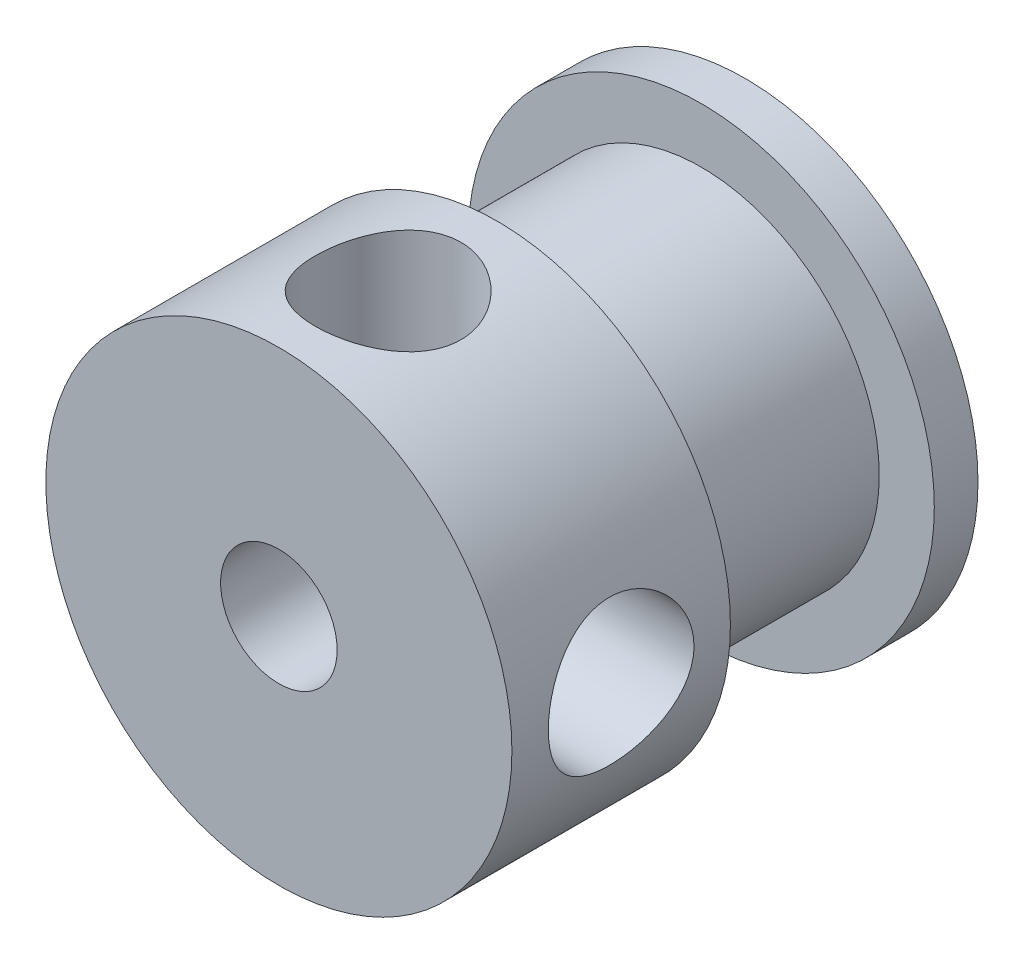
ISO-10303-21;
HEADER;
FILE_DESCRIPTION(('STEP AP214'),'2;1');
FILE_NAME('part.step','',(''),(''),'','','');
FILE_SCHEMA(('AUTOMOTIVE_DESIGN { 1 0 10303 214 1 1 1 1 }'));
ENDSEC;
DATA;
#1=APPLICATION_CONTEXT('core data for automotive mechanical design processes');
#2=APPLICATION_PROTOCOL_DEFINITION('international standard','automotive_design',2000,#1);
#3=PRODUCT_CONTEXT('',#1,'mechanical');
#4=PRODUCT('Part','Part','',(#3));
#5=PRODUCT_RELATED_PRODUCT_CATEGORY('part','',(#4));
#6=PRODUCT_DEFINITION_FORMATION('','',#4);
#7=PRODUCT_DEFINITION_CONTEXT('part definition',#1,'design');
#8=PRODUCT_DEFINITION('design','',#6,#7);
#9=PRODUCT_DEFINITION_SHAPE('','',#8);
#10=(LENGTH_UNIT() NAMED_UNIT(*) SI_UNIT(.MILLI.,.METRE.));
#11=(NAMED_UNIT(*) PLANE_ANGLE_UNIT() SI_UNIT($,.RADIAN.));
#12=(NAMED_UNIT(*) SI_UNIT($,.STERADIAN.) SOLID_ANGLE_UNIT());
#13=UNCERTAINTY_MEASURE_WITH_UNIT(LENGTH_MEASURE(1.E-05),#10,'distance_accuracy_value','');
#14=(GEOMETRIC_REPRESENTATION_CONTEXT(3) GLOBAL_UNCERTAINTY_ASSIGNED_CONTEXT((#13)) GLOBAL_UNIT_ASSIGNED_CONTEXT((#10,
#11,#12)) REPRESENTATION_CONTEXT('',''));
#15=CARTESIAN_POINT('',(0.,0.,0.));
#16=DIRECTION('',(0.,0.,1.));
#17=DIRECTION('',(1.,0.,0.));
#18=AXIS2_PLACEMENT_3D('',#15,#16,#17);
#19=CARTESIAN_POINT('',(0.,0.,1.5));
#20=DIRECTION('',(0.,0.,-1.));
#21=DIRECTION('',(-1.,0.,0.));
#22=AXIS2_PLACEMENT_3D('',#19,#20,#21);
#23=CYLINDRICAL_SURFACE('',#22,8.);
#24=CARTESIAN_POINT('',(0.,0.,1.5));
#25=DIRECTION('',(0.,0.,1.));
#26=DIRECTION('',(1.,0.,0.));
#27=AXIS2_PLACEMENT_3D('',#24,#25,#26);
#28=CIRCLE('',#27,8.);
#29=CARTESIAN_POINT('',(8.,0.,1.5));
#30=VERTEX_POINT('',#29);
#31=EDGE_CURVE('E147',#30,#30,#28,.T.);
#32=ORIENTED_EDGE('',*,*,#31,.F.);
#33=EDGE_LOOP('',(#32));
#34=FACE_BOUND('',#33,.T.);
#35=CARTESIAN_POINT('',(0.,0.,0.));
#36=DIRECTION('',(0.,0.,1.));
#37=DIRECTION('',(1.,0.,0.));
#38=AXIS2_PLACEMENT_3D('',#35,#36,#37);
#39=CIRCLE('',#38,8.);
#40=CARTESIAN_POINT('',(8.,0.,0.));
#41=VERTEX_POINT('',#40);
#42=EDGE_CURVE('E143',#41,#41,#39,.T.);
#43=ORIENTED_EDGE('',*,*,#42,.T.);
#44=EDGE_LOOP('',(#43));
#45=FACE_BOUND('',#44,.T.);
#46=ADVANCED_FACE('F34',(#34,#45),#23,.T.);
#47=CARTESIAN_POINT('',(0.,0.,1.5));
#48=DIRECTION('',(0.,0.,1.));
#49=DIRECTION('',(1.,0.,0.));
#50=AXIS2_PLACEMENT_3D('',#47,#48,#49);
#51=PLANE('',#50);
#52=CARTESIAN_POINT('',(0.,0.,1.5));
#53=DIRECTION('',(0.,0.,1.));
#54=DIRECTION('',(1.,0.,0.));
#55=AXIS2_PLACEMENT_3D('',#52,#53,#54);
#56=CIRCLE('',#55,6.11);
#57=CARTESIAN_POINT('',(6.11,0.,1.5));
#58=VERTEX_POINT('',#57);
#59=EDGE_CURVE('E144',#58,#58,#56,.T.);
#60=ORIENTED_EDGE('',*,*,#59,.F.);
#61=EDGE_LOOP('',(#60));
#62=FACE_BOUND('',#61,.T.);
#63=ORIENTED_EDGE('',*,*,#31,.T.);
#64=EDGE_LOOP('',(#63));
#65=FACE_BOUND('',#64,.T.);
#66=ADVANCED_FACE('F188',(#62,#65),#51,.T.);
#67=CARTESIAN_POINT('',(0.,0.,0.));
#68=DIRECTION('',(0.,0.,1.));
#69=DIRECTION('',(1.,0.,0.));
#70=AXIS2_PLACEMENT_3D('',#67,#68,#69);
#71=PLANE('',#70);
#72=CARTESIAN_POINT('',(0.,0.,0.));
#73=DIRECTION('',(0.,0.,1.));
#74=DIRECTION('',(1.,0.,0.));
#75=AXIS2_PLACEMENT_3D('',#72,#73,#74);
#76=CIRCLE('',#75,2.);
#77=CARTESIAN_POINT('',(2.,0.,0.));
#78=VERTEX_POINT('',#77);
#79=EDGE_CURVE('E133',#78,#78,#76,.F.);
#80=ORIENTED_EDGE('',*,*,#79,.F.);
#81=EDGE_LOOP('',(#80));
#82=FACE_BOUND('',#81,.T.);
#83=ORIENTED_EDGE('',*,*,#42,.F.);
#84=EDGE_LOOP('',(#83));
#85=FACE_BOUND('',#84,.T.);
#86=ADVANCED_FACE('F193',(#82,#85),#71,.F.);
#87=CARTESIAN_POINT('',(0.,0.,8.5));
#88=DIRECTION('',(0.,0.,-1.));
#89=DIRECTION('',(-1.,0.,0.));
#90=AXIS2_PLACEMENT_3D('',#87,#88,#89);
#91=CYLINDRICAL_SURFACE('',#90,6.11);
#92=CARTESIAN_POINT('',(0.,0.,8.5));
#93=DIRECTION('',(0.,0.,1.));
#94=DIRECTION('',(1.,0.,0.));
#95=AXIS2_PLACEMENT_3D('',#92,#93,#94);
#96=CIRCLE('',#95,6.11);
#97=CARTESIAN_POINT('',(6.11,0.,8.5));
#98=VERTEX_POINT('',#97);
#99=EDGE_CURVE('E135',#98,#98,#96,.T.);
#100=ORIENTED_EDGE('',*,*,#99,.F.);
#101=EDGE_LOOP('',(#100));
#102=FACE_BOUND('',#101,.T.);
#103=ORIENTED_EDGE('',*,*,#59,.T.);
#104=EDGE_LOOP('',(#103));
#105=FACE_BOUND('',#104,.T.);
#106=ADVANCED_FACE('F120',(#102,#105),#91,.T.);
#107=CARTESIAN_POINT('',(0.,0.,16.));
#108=DIRECTION('',(0.,0.,-1.));
#109=DIRECTION('',(-1.,0.,0.));
#110=AXIS2_PLACEMENT_3D('',#107,#108,#109);
#111=CYLINDRICAL_SURFACE('',#110,8.);
#112=CARTESIAN_POINT('',(0.,8.,9.75));
#113=CARTESIAN_POINT('',(-0.136878370349093,7.9999993175598,9.75000089317516));
#114=CARTESIAN_POINT('',(-0.273766105005718,7.99645389969682,9.76127845388891));
#115=CARTESIAN_POINT('',(-0.543538419176896,7.98265788177613,9.80597248307847));
#116=CARTESIAN_POINT('',(-0.676422085451814,7.97240576399719,9.83939396272872));
#117=CARTESIAN_POINT('',(-0.934257087301612,7.94631631395819,9.92713874239148));
#118=CARTESIAN_POINT('',(-1.05922035397161,7.9304876299805,9.98142968930593));
#119=CARTESIAN_POINT('',(-1.29826960469292,7.89487938322185,10.1092346353567));
#120=CARTESIAN_POINT('',(-1.41235387088977,7.8750991979981,10.1827516635612));
#121=CARTESIAN_POINT('',(-1.62993066990456,7.83300427480565,10.3493119840347));
#122=CARTESIAN_POINT('',(-1.73304005631332,7.81063431853978,10.4428417701221));
#123=CARTESIAN_POINT('',(-1.92239476407399,7.76620092748417,10.6457367848271));
#124=CARTESIAN_POINT('',(-2.00863694579739,7.74413755046914,10.7551049549891));
#125=CARTESIAN_POINT('',(-2.16388672966227,7.70222289396344,10.9898891276162));
#126=CARTESIAN_POINT('',(-2.23241568300257,7.68243976603591,11.1156349550544));
#127=CARTESIAN_POINT('',(-2.34719482153343,7.64815603598469,11.3775846299637));
#128=CARTESIAN_POINT('',(-2.39345087543889,7.63365404257377,11.5137857115879));
#129=CARTESIAN_POINT('',(-2.46096919860067,7.61215213969002,11.7884561549041));
#130=CARTESIAN_POINT('',(-2.48294220015729,7.60493945859017,11.9267336872777));
#131=CARTESIAN_POINT('',(-2.50349110073976,7.59820110281901,12.2051862378238));
#132=CARTESIAN_POINT('',(-2.50207321991544,7.59867338454669,12.3453607416433));
#133=CARTESIAN_POINT('',(-2.47643649465478,7.60706378150876,12.617748920538));
#134=CARTESIAN_POINT('',(-2.45312115738766,7.61468683491897,12.7500582517231));
#135=CARTESIAN_POINT('',(-2.38581626711252,7.63604051304978,13.0087843130747));
#136=CARTESIAN_POINT('',(-2.34182451689101,7.6497717868623,13.1352004154176));
#137=CARTESIAN_POINT('',(-2.23377749362554,7.68202088028593,13.3807038888653));
#138=CARTESIAN_POINT('',(-2.16943851324163,7.70060569321649,13.499657221384));
#139=CARTESIAN_POINT('',(-2.02272041475696,7.7404371316014,13.7253755357582));
#140=CARTESIAN_POINT('',(-1.94033661043154,7.76168444789102,13.8321373405074));
#141=CARTESIAN_POINT('',(-1.75543390836425,7.80563055600986,14.035549886834));
#142=CARTESIAN_POINT('',(-1.65216914118563,7.82835139211391,14.1315191155594));
#143=CARTESIAN_POINT('',(-1.43072881619106,7.8718314151916,14.3049437871594));
#144=CARTESIAN_POINT('',(-1.31255215469804,7.89259045676745,14.3823978584384));
#145=CARTESIAN_POINT('',(-1.06332922093091,7.93002589780382,14.5170553772025));
#146=CARTESIAN_POINT('',(-0.932189813838559,7.94666921296415,14.5740962709279));
#147=CARTESIAN_POINT('',(-0.661535955565289,7.97375911657108,14.6651060017031));
#148=CARTESIAN_POINT('',(-0.522024061449216,7.98420758650304,14.6990818444768));
#149=CARTESIAN_POINT('',(-0.244370314580689,7.99742778790027,14.741836085158));
#150=CARTESIAN_POINT('',(-0.106383697577686,8.00048045790873,14.751537087187));
#151=CARTESIAN_POINT('',(0.169260611465172,7.99939599461967,14.7480675467253));
#152=CARTESIAN_POINT('',(0.306918348613018,7.9952599116227,14.7349003453548));
#153=CARTESIAN_POINT('',(0.574438665951697,7.98044727539523,14.6868088147872));
#154=CARTESIAN_POINT('',(0.704409956841872,7.96993586221374,14.652433464775));
#155=CARTESIAN_POINT('',(0.956703857722752,7.94360242758579,14.5635712952666));
#156=CARTESIAN_POINT('',(1.07902552089812,7.92777975028687,14.50908199195));
#157=CARTESIAN_POINT('',(1.31586481334437,7.89197085518848,14.3800535669026));
#158=CARTESIAN_POINT('',(1.43011947957558,7.87189253635335,14.3050580250064));
#159=CARTESIAN_POINT('',(1.64473170192052,7.82986820006859,14.1376935797652));
#160=CARTESIAN_POINT('',(1.7450854760879,7.80792167695774,14.0453199645107));
#161=CARTESIAN_POINT('',(1.93317492583804,7.76353989766283,13.8414822198958));
#162=CARTESIAN_POINT('',(2.02025304679062,7.74111973412883,13.7294066725216));
#163=CARTESIAN_POINT('',(2.17442500490303,7.69923894191212,13.4917467672465));
#164=CARTESIAN_POINT('',(2.24151915946859,7.67977826622621,13.366162623946));
#165=CARTESIAN_POINT('',(2.35340166961084,7.64623564661738,13.105309654259));
#166=CARTESIAN_POINT('',(2.39827639112025,7.63213292713749,12.9700807011286));
#167=CARTESIAN_POINT('',(2.4644578863618,7.6110234168862,12.6934550135028));
#168=CARTESIAN_POINT('',(2.48577362827989,7.60401392602456,12.5520606473129));
#169=CARTESIAN_POINT('',(2.50358812316251,7.59816585427753,12.2739918248391));
#170=CARTESIAN_POINT('',(2.50116559243271,7.59897209200283,12.1373930923052));
#171=CARTESIAN_POINT('',(2.47417636257668,7.60780180751807,11.8666508301161));
#172=CARTESIAN_POINT('',(2.44961069645024,7.61582494863208,11.7325071862265));
#173=CARTESIAN_POINT('',(2.37975459827235,7.6379362836678,11.4724119208162));
#174=CARTESIAN_POINT('',(2.33477284812016,7.65193396380514,11.3463691178133));
#175=CARTESIAN_POINT('',(2.22560454669999,7.68439408509128,11.103519172932));
#176=CARTESIAN_POINT('',(2.16141408888473,7.70285743429343,10.9867139158432));
#177=CARTESIAN_POINT('',(2.01271350026986,7.74306974067005,10.7607080591204));
#178=CARTESIAN_POINT('',(1.92750667048264,7.76491897845914,10.6519837409995));
#179=CARTESIAN_POINT('',(1.7404179928096,7.8089799764242,10.450027343776));
#180=CARTESIAN_POINT('',(1.63853168468878,7.83119183213309,10.3567994220179));
#181=CARTESIAN_POINT('',(1.41697332564669,7.87434543904947,10.1854349232741));
#182=CARTESIAN_POINT('',(1.29682914897477,7.89522203461345,10.1078905271001));
#183=CARTESIAN_POINT('',(1.0445582760273,7.93253538593756,9.97420216972109));
#184=CARTESIAN_POINT('',(0.912436315590897,7.94897388631644,9.91804979571633));
#185=CARTESIAN_POINT('',(0.651495270747957,7.97441301466941,9.83281726478307));
#186=CARTESIAN_POINT('',(0.523340674225093,7.98392481612283,9.80185026538933));
#187=CARTESIAN_POINT('',(0.263459790880496,7.99671800680967,9.76044328006457));
#188=CARTESIAN_POINT('',(0.13173423227935,8.00000065679286,9.749999140392));
#189=CARTESIAN_POINT('',(0.,8.,9.75));
#190=B_SPLINE_CURVE_WITH_KNOTS('',3,(#112,#113,#114,#115,#116,#117,#118,#119,#120,#121,#122,
#123,#124,#125,#126,#127,#128,#129,#130,#131,#132,#133,#134,#135,#136,#137,#138,#139,#140,#141,
#142,#143,#144,#145,#146,#147,#148,#149,#150,#151,#152,#153,#154,#155,#156,#157,#158,#159,#160,
#161,#162,#163,#164,#165,#166,#167,#168,#169,#170,#171,#172,#173,#174,#175,#176,#177,#178,#179,
#180,#181,#182,#183,#184,#185,#186,#187,#188,#189),.UNSPECIFIED.,.T.,.F.,(4,2,2,2,2,2,2,2,2,2,2,
2,2,2,2,2,2,2,2,2,2,2,2,2,2,2,2,2,2,2,2,2,2,2,2,2,2,2,4),(0.,0.410150898865019,
0.820394646698132,1.23000495840487,1.63967984311678,2.06075644390316,2.48191134862552,
2.91347542494988,3.34492572559054,3.7633830033442,4.18172900590276,4.58353834844338,
4.98539039958125,5.3931128544109,5.80094132020717,6.227334945592,6.65376014826606,
7.0835092137954,7.51312768989108,7.92615137096475,8.33911471298725,8.74181253445744,
9.14456010068999,9.55712649476686,9.96980491418518,10.3988355742628,10.8278594196742,
11.2552023150671,11.6823824779468,12.0902440696666,12.4980866352126,12.8999582681244,
13.3019116867944,13.7195902803182,14.1373807476578,14.5688133627192,15.0000761335177,
15.3948927332218,15.7896294154519),.UNSPECIFIED.);
#191=CARTESIAN_POINT('',(0.,8.,9.75));
#192=VERTEX_POINT('',#191);
#193=EDGE_CURVE('E72',#192,#192,#190,.T.);
#194=ORIENTED_EDGE('',*,*,#193,.F.);
#195=EDGE_LOOP('',(#194));
#196=FACE_BOUND('',#195,.T.);
#197=CARTESIAN_POINT('',(8.,0.,14.75));
#198=CARTESIAN_POINT('',(7.9999993175598,-0.136878370349093,14.7499991068248));
#199=CARTESIAN_POINT('',(7.99645389969682,-0.273766105005718,14.7387215461111));
#200=CARTESIAN_POINT('',(7.98265788177613,-0.543538419176896,14.6940275169215));
#201=CARTESIAN_POINT('',(7.97240576399719,-0.676422085451814,14.6606060372713));
#202=CARTESIAN_POINT('',(7.94631631395819,-0.934257087301612,14.5728612576085));
#203=CARTESIAN_POINT('',(7.9304876299805,-1.05922035397161,14.5185703106941));
#204=CARTESIAN_POINT('',(7.89487938322185,-1.29826960469292,14.3907653646433));
#205=CARTESIAN_POINT('',(7.8750991979981,-1.41235387088977,14.3172483364388));
#206=CARTESIAN_POINT('',(7.83300427480565,-1.62993066990456,14.1506880159653));
#207=CARTESIAN_POINT('',(7.81063431853978,-1.73304005631332,14.0571582298779));
#208=CARTESIAN_POINT('',(7.76620092748417,-1.92239476407399,13.8542632151729));
#209=CARTESIAN_POINT('',(7.74413755046914,-2.00863694579739,13.7448950450109));
#210=CARTESIAN_POINT('',(7.70222289396344,-2.16388672966227,13.5101108723838));
#211=CARTESIAN_POINT('',(7.68243976603591,-2.23241568300257,13.3843650449456));
#212=CARTESIAN_POINT('',(7.64815603598469,-2.34719482153343,13.1224153700363));
#213=CARTESIAN_POINT('',(7.63365404257377,-2.39345087543889,12.9862142884121));
#214=CARTESIAN_POINT('',(7.61215213969002,-2.46096919860067,12.7115438450959));
#215=CARTESIAN_POINT('',(7.60493945859017,-2.48294220015729,12.5732663127223));
#216=CARTESIAN_POINT('',(7.59820110281901,-2.50349110073976,12.2948137621762));
#217=CARTESIAN_POINT('',(7.59867338454669,-2.50207321991544,12.1546392583567));
#218=CARTESIAN_POINT('',(7.60706378150876,-2.47643649465478,11.882251079462));
#219=CARTESIAN_POINT('',(7.61468683491897,-2.45312115738766,11.7499417482769));
#220=CARTESIAN_POINT('',(7.63604051304978,-2.38581626711252,11.4912156869253));
#221=CARTESIAN_POINT('',(7.6497717868623,-2.34182451689101,11.3647995845824));
#222=CARTESIAN_POINT('',(7.68202088028593,-2.23377749362554,11.1192961111347));
#223=CARTESIAN_POINT('',(7.70060569321649,-2.16943851324163,11.000342778616));
#224=CARTESIAN_POINT('',(7.7404371316014,-2.02272041475696,10.7746244642418));
#225=CARTESIAN_POINT('',(7.76168444789102,-1.94033661043154,10.6678626594926));
#226=CARTESIAN_POINT('',(7.80563055600986,-1.75543390836425,10.464450113166));
#227=CARTESIAN_POINT('',(7.82835139211391,-1.65216914118563,10.3684808844406));
#228=CARTESIAN_POINT('',(7.8718314151916,-1.43072881619106,10.1950562128406));
#229=CARTESIAN_POINT('',(7.89259045676745,-1.31255215469804,10.1176021415616));
#230=CARTESIAN_POINT('',(7.93002589780382,-1.06332922093091,9.98294462279745));
#231=CARTESIAN_POINT('',(7.94666921296415,-0.932189813838559,9.92590372907206));
#232=CARTESIAN_POINT('',(7.97375911657108,-0.661535955565288,9.83489399829687));
#233=CARTESIAN_POINT('',(7.98420758650304,-0.522024061449216,9.80091815552321));
#234=CARTESIAN_POINT('',(7.99742778790027,-0.244370314580689,9.75816391484204));
#235=CARTESIAN_POINT('',(8.00048045790873,-0.106383697577686,9.74846291281295));
#236=CARTESIAN_POINT('',(7.99939599461967,0.169260611465172,9.75193245327466));
#237=CARTESIAN_POINT('',(7.9952599116227,0.306918348613018,9.76509965464522));
#238=CARTESIAN_POINT('',(7.98044727539523,0.574438665951697,9.81319118521277));
#239=CARTESIAN_POINT('',(7.96993586221374,0.704409956841873,9.84756653522498));
#240=CARTESIAN_POINT('',(7.94360242758579,0.956703857722753,9.93642870473343));
#241=CARTESIAN_POINT('',(7.92777975028687,1.07902552089812,9.99091800805003));
#242=CARTESIAN_POINT('',(7.89197085518848,1.31586481334438,10.1199464330974));
#243=CARTESIAN_POINT('',(7.87189253635335,1.43011947957558,10.1949419749936));
#244=CARTESIAN_POINT('',(7.82986820006859,1.64473170192052,10.3623064202348));
#245=CARTESIAN_POINT('',(7.80792167695774,1.7450854760879,10.4546800354893));
#246=CARTESIAN_POINT('',(7.76353989766283,1.93317492583804,10.6585177801042));
#247=CARTESIAN_POINT('',(7.74111973412883,2.02025304679062,10.7705933274784));
#248=CARTESIAN_POINT('',(7.69923894191212,2.17442500490303,11.0082532327535));
#249=CARTESIAN_POINT('',(7.67977826622621,2.24151915946859,11.133837376054));
#250=CARTESIAN_POINT('',(7.64623564661738,2.35340166961084,11.394690345741));
#251=CARTESIAN_POINT('',(7.63213292713749,2.39827639112025,11.5299192988714));
#252=CARTESIAN_POINT('',(7.6110234168862,2.4644578863618,11.8065449864972));
#253=CARTESIAN_POINT('',(7.60401392602456,2.48577362827989,11.9479393526871));
#254=CARTESIAN_POINT('',(7.59816585427753,2.50358812316251,12.2260081751609));
#255=CARTESIAN_POINT('',(7.59897209200284,2.50116559243271,12.3626069076948));
#256=CARTESIAN_POINT('',(7.60780180751807,2.47417636257667,12.6333491698839));
#257=CARTESIAN_POINT('',(7.61582494863208,2.44961069645024,12.7674928137735));
#258=CARTESIAN_POINT('',(7.6379362836678,2.37975459827235,13.0275880791838));
#259=CARTESIAN_POINT('',(7.65193396380513,2.33477284812016,13.1536308821867));
#260=CARTESIAN_POINT('',(7.68439408509128,2.22560454669999,13.396480827068));
#261=CARTESIAN_POINT('',(7.70285743429343,2.16141408888473,13.5132860841568));
#262=CARTESIAN_POINT('',(7.74306974067005,2.01271350026986,13.7392919408796));
#263=CARTESIAN_POINT('',(7.76491897845914,1.92750667048264,13.8480162590005));
#264=CARTESIAN_POINT('',(7.8089799764242,1.7404179928096,14.049972656224));
#265=CARTESIAN_POINT('',(7.83119183213309,1.63853168468878,14.1432005779821));
#266=CARTESIAN_POINT('',(7.87434543904947,1.41697332564669,14.3145650767259));
#267=CARTESIAN_POINT('',(7.89522203461345,1.29682914897477,14.3921094728999));
#268=CARTESIAN_POINT('',(7.93253538593756,1.0445582760273,14.5257978302789));
#269=CARTESIAN_POINT('',(7.94897388631644,0.912436315590897,14.5819502042837));
#270=CARTESIAN_POINT('',(7.97441301466941,0.651495270747957,14.6671827352169));
#271=CARTESIAN_POINT('',(7.98392481612283,0.523340674225092,14.6981497346107));
#272=CARTESIAN_POINT('',(7.99671800680967,0.263459790880495,14.7395567199354));
#273=CARTESIAN_POINT('',(8.00000065679286,0.13173423227935,14.750000859608));
#274=CARTESIAN_POINT('',(8.,0.,14.75));
#275=B_SPLINE_CURVE_WITH_KNOTS('',3,(#197,#198,#199,#200,#201,#202,#203,#204,#205,#206,#207,
#208,#209,#210,#211,#212,#213,#214,#215,#216,#217,#218,#219,#220,#221,#222,#223,#224,#225,#226,
#227,#228,#229,#230,#231,#232,#233,#234,#235,#236,#237,#238,#239,#240,#241,#242,#243,#244,#245,
#246,#247,#248,#249,#250,#251,#252,#253,#254,#255,#256,#257,#258,#259,#260,#261,#262,#263,#264,
#265,#266,#267,#268,#269,#270,#271,#272,#273,#274),.UNSPECIFIED.,.T.,.F.,(4,2,2,2,2,2,2,2,2,2,2,
2,2,2,2,2,2,2,2,2,2,2,2,2,2,2,2,2,2,2,2,2,2,2,2,2,2,2,4),(0.,0.410150898865019,
0.820394646698132,1.23000495840487,1.63967984311678,2.06075644390316,2.48191134862552,
2.91347542494988,3.34492572559054,3.7633830033442,4.18172900590276,4.58353834844338,
4.98539039958125,5.3931128544109,5.80094132020717,6.227334945592,6.65376014826606,
7.0835092137954,7.51312768989108,7.92615137096475,8.33911471298725,8.74181253445744,
9.14456010068999,9.55712649476686,9.96980491418518,10.3988355742628,10.8278594196742,
11.2552023150671,11.6823824779468,12.0902440696666,12.4980866352126,12.8999582681244,
13.3019116867944,13.7195902803182,14.1373807476578,14.5688133627192,15.0000761335177,
15.3948927332218,15.7896294154519),.UNSPECIFIED.);
#276=CARTESIAN_POINT('',(8.,0.,14.75));
#277=VERTEX_POINT('',#276);
#278=EDGE_CURVE('E84',#277,#277,#275,.T.);
#279=ORIENTED_EDGE('',*,*,#278,.F.);
#280=EDGE_LOOP('',(#279));
#281=FACE_BOUND('',#280,.T.);
#282=CARTESIAN_POINT('',(0.,0.,16.));
#283=DIRECTION('',(0.,0.,1.));
#284=DIRECTION('',(1.,0.,0.));
#285=AXIS2_PLACEMENT_3D('',#282,#283,#284);
#286=CIRCLE('',#285,8.);
#287=CARTESIAN_POINT('',(8.,0.,16.));
#288=VERTEX_POINT('',#287);
#289=EDGE_CURVE('E128',#288,#288,#286,.T.);
#290=ORIENTED_EDGE('',*,*,#289,.F.);
#291=EDGE_LOOP('',(#290));
#292=FACE_BOUND('',#291,.T.);
#293=CARTESIAN_POINT('',(0.,0.,8.5));
#294=DIRECTION('',(0.,0.,1.));
#295=DIRECTION('',(1.,0.,0.));
#296=AXIS2_PLACEMENT_3D('',#293,#294,#295);
#297=CIRCLE('',#296,8.);
#298=CARTESIAN_POINT('',(8.,0.,8.5));
#299=VERTEX_POINT('',#298);
#300=EDGE_CURVE('E131',#299,#299,#297,.T.);
#301=ORIENTED_EDGE('',*,*,#300,.T.);
#302=EDGE_LOOP('',(#301));
#303=FACE_BOUND('',#302,.T.);
#304=ADVANCED_FACE('F116',(#196,#281,#292,#303),#111,.T.);
#305=CARTESIAN_POINT('',(0.,0.,16.));
#306=DIRECTION('',(0.,0.,1.));
#307=DIRECTION('',(1.,0.,0.));
#308=AXIS2_PLACEMENT_3D('',#305,#306,#307);
#309=PLANE('',#308);
#310=CARTESIAN_POINT('',(0.,0.,16.));
#311=DIRECTION('',(0.,0.,1.));
#312=DIRECTION('',(1.,0.,0.));
#313=AXIS2_PLACEMENT_3D('',#310,#311,#312);
#314=CIRCLE('',#313,2.);
#315=CARTESIAN_POINT('',(2.,0.,16.));
#316=VERTEX_POINT('',#315);
#317=EDGE_CURVE('E138',#316,#316,#314,.T.);
#318=ORIENTED_EDGE('',*,*,#317,.F.);
#319=EDGE_LOOP('',(#318));
#320=FACE_BOUND('',#319,.T.);
#321=ORIENTED_EDGE('',*,*,#289,.T.);
#322=EDGE_LOOP('',(#321));
#323=FACE_BOUND('',#322,.T.);
#324=ADVANCED_FACE('F119',(#320,#323),#309,.T.);
#325=CARTESIAN_POINT('',(0.,0.,8.5));
#326=DIRECTION('',(0.,0.,1.));
#327=DIRECTION('',(1.,0.,0.));
#328=AXIS2_PLACEMENT_3D('',#325,#326,#327);
#329=PLANE('',#328);
#330=ORIENTED_EDGE('',*,*,#99,.T.);
#331=EDGE_LOOP('',(#330));
#332=FACE_BOUND('',#331,.T.);
#333=ORIENTED_EDGE('',*,*,#300,.F.);
#334=EDGE_LOOP('',(#333));
#335=FACE_BOUND('',#334,.T.);
#336=ADVANCED_FACE('F181',(#332,#335),#329,.F.);
#337=CARTESIAN_POINT('',(0.,0.,-5.65685424949238));
#338=DIRECTION('',(0.,0.,1.));
#339=DIRECTION('',(1.,0.,0.));
#340=AXIS2_PLACEMENT_3D('',#337,#338,#339);
#341=CYLINDRICAL_SURFACE('',#340,2.);
#342=CARTESIAN_POINT('',(0.,-2.,10.75));
#343=CARTESIAN_POINT('',(0.0379479235645884,-2.00000627516936,10.7500192832936));
#344=CARTESIAN_POINT('',(0.0758715125330174,-1.99891949492475,10.7485586292335));
#345=CARTESIAN_POINT('',(0.151324616943133,-1.99462303531531,10.7428506651432));
#346=CARTESIAN_POINT('',(0.188854691384794,-1.99141695739297,10.7386080826993));
#347=CARTESIAN_POINT('',(0.29949872538153,-1.97882613787581,10.7221125312776));
#348=CARTESIAN_POINT('',(0.371732844659708,-1.96646480032562,10.7060818515515));
#349=CARTESIAN_POINT('',(0.537409103395217,-1.92893517586302,10.6592845529774));
#350=CARTESIAN_POINT('',(0.62921403907605,-1.90076994665305,10.6253000488365));
#351=CARTESIAN_POINT('',(0.805580625105265,-1.83304379692472,10.5492473445724));
#352=CARTESIAN_POINT('',(0.890082981082209,-1.79339924041707,10.5071205991264));
#353=CARTESIAN_POINT('',(1.02558262828789,-1.71816854919064,10.4334857875581));
#354=CARTESIAN_POINT('',(1.07864912297947,-1.68534267567649,10.4028930271668));
#355=CARTESIAN_POINT('',(1.18128295148499,-1.61506745369566,10.3411393234775));
#356=CARTESIAN_POINT('',(1.23084904356491,-1.57761647733982,10.3099781834358));
#357=CARTESIAN_POINT('',(1.37401295816225,-1.45858551233656,10.2171188469575));
#358=CARTESIAN_POINT('',(1.46240082327104,-1.37014665414416,10.1558576884683));
#359=CARTESIAN_POINT('',(1.607110183375,-1.19475582360512,10.0520851498912));
#360=CARTESIAN_POINT('',(1.66631825109136,-1.11094626427001,10.008258049745));
#361=CARTESIAN_POINT('',(1.77235424283216,-0.932465485481839,9.92835849623924));
#362=CARTESIAN_POINT('',(1.81919914273619,-0.837809418392459,9.89227542240878));
#363=CARTESIAN_POINT('',(1.89171401253228,-0.655315349169764,9.83584253405035));
#364=CARTESIAN_POINT('',(1.9195834564288,-0.56885115648575,9.81389188486139));
#365=CARTESIAN_POINT('',(1.96349894859723,-0.391185851002275,9.77914072513437));
#366=CARTESIAN_POINT('',(1.97955176913513,-0.299987483557978,9.76633497365817));
#367=CARTESIAN_POINT('',(1.99885816607462,-0.115048014900797,9.75092023965451));
#368=CARTESIAN_POINT('',(2.0020672236063,-0.0212992015040167,9.74834672416155));
#369=CARTESIAN_POINT('',(1.99533569409933,0.165416909097585,9.75373069874957));
#370=CARTESIAN_POINT('',(1.98539457656509,0.258384174621462,9.7616886136825));
#371=CARTESIAN_POINT('',(1.95393238399736,0.435681508631691,9.78671604790884));
#372=CARTESIAN_POINT('',(1.93307218828801,0.52020613946849,9.80326515546445));
#373=CARTESIAN_POINT('',(1.88130624310027,0.684168049314896,9.84395390798661));
#374=CARTESIAN_POINT('',(1.85039747897462,0.763603793047829,9.86809583078477));
#375=CARTESIAN_POINT('',(1.77639467927143,0.923537337819448,9.92514135165621));
#376=CARTESIAN_POINT('',(1.73241299830103,1.00339882615072,9.9586653698531));
#377=CARTESIAN_POINT('',(1.63544935775648,1.15472609083026,10.0310689116642));
#378=CARTESIAN_POINT('',(1.58246450599093,1.22618915673876,10.0699501554797));
#379=CARTESIAN_POINT('',(1.45697738931794,1.374219156259,10.1594370184457));
#380=CARTESIAN_POINT('',(1.38270195687676,1.44881598705261,10.2108098488581));
#381=CARTESIAN_POINT('',(1.22383919624223,1.58531375973435,10.3150164410009));
#382=CARTESIAN_POINT('',(1.13922791858779,1.64718428838877,10.3678533677141));
#383=CARTESIAN_POINT('',(0.968601510540931,1.75239685151698,10.4656905538265));
#384=CARTESIAN_POINT('',(0.883480110693942,1.79693944796438,10.510958851653));
#385=CARTESIAN_POINT('',(0.705198578374325,1.87404146815186,10.5943542145842));
#386=CARTESIAN_POINT('',(0.612095980534061,1.9066789985219,10.6325269899097));
#387=CARTESIAN_POINT('',(0.474667558572587,1.94330582467938,10.6771497891965));
#388=CARTESIAN_POINT('',(0.433587088460276,1.95289796969603,10.6891116074273));
#389=CARTESIAN_POINT('',(0.350214925038936,1.96955718049842,10.7101875661776));
#390=CARTESIAN_POINT('',(0.307924135831966,1.97662608056367,10.719303774713));
#391=CARTESIAN_POINT('',(0.221704168570528,1.98815564615196,10.7343039183287));
#392=CARTESIAN_POINT('',(0.17775963121835,1.99257304931841,10.7401341501981));
#393=CARTESIAN_POINT('',(0.0892218491834877,1.99850713013866,10.7480094616981));
#394=CARTESIAN_POINT('',(0.0446271554933414,2.00001581611392,10.750044112503));
#395=CARTESIAN_POINT('',(0.,2.00000000000001,10.7499999999999));
#396=B_SPLINE_CURVE_WITH_KNOTS('',3,(#342,#343,#344,#345,#346,#347,#348,#349,#350,#351,#352,
#353,#354,#355,#356,#357,#358,#359,#360,#361,#362,#363,#364,#365,#366,#367,#368,#369,#370,#371,
#372,#373,#374,#375,#376,#377,#378,#379,#380,#381,#382,#383,#384,#385,#386,#387,#388,#389,#390,
#391,#392,#393,#394,#395),.UNSPECIFIED.,.F.,.F.,(4,2,2,2,2,2,2,2,2,2,2,2,2,2,2,2,2,2,2,2,2,2,2,
2,2,2,4),(0.,0.113757193471516,0.227321568172488,0.451299564493482,0.75525467173961,
1.06148258973336,1.26972686170817,1.47804463906282,1.89344715635985,2.22697671028542,
2.56004588320835,2.83923917448484,3.11827233148146,3.39827183597835,3.67828263637285,
3.94302745220543,4.20785176691214,4.49821446798836,4.78867062254808,5.13882801676877,
5.4898127340711,5.80751926470776,6.12310221470074,6.25450167031456,6.38580540927623,
6.51919707877701,6.65295472151382),.UNSPECIFIED.);
#397=CARTESIAN_POINT('',(0.,-2.,10.75));
#398=VERTEX_POINT('',#397);
#399=CARTESIAN_POINT('',(1.41421356237287,1.41421356237385,10.1884471871904));
#400=VERTEX_POINT('',#399);
#401=EDGE_CURVE('E80',#398,#400,#396,.T.);
#402=ORIENTED_EDGE('',*,*,#401,.T.);
#403=CARTESIAN_POINT('',(2.,0.,10.75));
#404=CARTESIAN_POINT('',(2.00000627516936,0.0379479235645884,10.7500192832936));
#405=CARTESIAN_POINT('',(1.99891949492475,0.0758715125330174,10.7485586292335));
#406=CARTESIAN_POINT('',(1.99462303531531,0.151324616943133,10.7428506651432));
#407=CARTESIAN_POINT('',(1.99141695739297,0.188854691384794,10.7386080826993));
#408=CARTESIAN_POINT('',(1.97882613787581,0.29949872538153,10.7221125312776));
#409=CARTESIAN_POINT('',(1.96646480032562,0.371732844659708,10.7060818515515));
#410=CARTESIAN_POINT('',(1.92893517586302,0.537409103395217,10.6592845529774));
#411=CARTESIAN_POINT('',(1.90076994665305,0.62921403907605,10.6253000488365));
#412=CARTESIAN_POINT('',(1.83304379692472,0.805580625105265,10.5492473445724));
#413=CARTESIAN_POINT('',(1.79339924041707,0.890082981082209,10.5071205991264));
#414=CARTESIAN_POINT('',(1.71816854919064,1.02558262828789,10.4334857875581));
#415=CARTESIAN_POINT('',(1.68534267567649,1.07864912297947,10.4028930271668));
#416=CARTESIAN_POINT('',(1.61506745369566,1.18128295148499,10.3411393234775));
#417=CARTESIAN_POINT('',(1.57761647733982,1.23084904356491,10.3099781834358));
#418=CARTESIAN_POINT('',(1.45858551233656,1.37401295816225,10.2171188469575));
#419=CARTESIAN_POINT('',(1.37014665414416,1.46240082327104,10.1558576884683));
#420=CARTESIAN_POINT('',(1.19475582360512,1.607110183375,10.0520851498912));
#421=CARTESIAN_POINT('',(1.11094626427001,1.66631825109136,10.008258049745));
#422=CARTESIAN_POINT('',(0.932465485481839,1.77235424283216,9.92835849623924));
#423=CARTESIAN_POINT('',(0.837809418392459,1.81919914273619,9.89227542240878));
#424=CARTESIAN_POINT('',(0.655315349169764,1.89171401253228,9.83584253405035));
#425=CARTESIAN_POINT('',(0.56885115648575,1.9195834564288,9.81389188486139));
#426=CARTESIAN_POINT('',(0.391185851002275,1.96349894859723,9.77914072513437));
#427=CARTESIAN_POINT('',(0.299987483557978,1.97955176913513,9.76633497365817));
#428=CARTESIAN_POINT('',(0.115048014900797,1.99885816607462,9.75092023965451));
#429=CARTESIAN_POINT('',(0.0212992015040167,2.0020672236063,9.74834672416155));
#430=CARTESIAN_POINT('',(-0.165416909097585,1.99533569409933,9.75373069874957));
#431=CARTESIAN_POINT('',(-0.258384174621462,1.98539457656509,9.7616886136825));
#432=CARTESIAN_POINT('',(-0.435681508631691,1.95393238399736,9.78671604790884));
#433=CARTESIAN_POINT('',(-0.52020613946849,1.93307218828801,9.80326515546445));
#434=CARTESIAN_POINT('',(-0.684168049314896,1.88130624310027,9.84395390798661));
#435=CARTESIAN_POINT('',(-0.763603793047829,1.85039747897462,9.86809583078477));
#436=CARTESIAN_POINT('',(-0.923537337819448,1.77639467927143,9.92514135165621));
#437=CARTESIAN_POINT('',(-1.00339882615072,1.73241299830103,9.9586653698531));
#438=CARTESIAN_POINT('',(-1.15472609083026,1.63544935775648,10.0310689116642));
#439=CARTESIAN_POINT('',(-1.22618915673876,1.58246450599093,10.0699501554797));
#440=CARTESIAN_POINT('',(-1.374219156259,1.45697738931794,10.1594370184457));
#441=CARTESIAN_POINT('',(-1.44881598705261,1.38270195687676,10.2108098488581));
#442=CARTESIAN_POINT('',(-1.58531375973435,1.22383919624223,10.3150164410009));
#443=CARTESIAN_POINT('',(-1.64718428838877,1.13922791858779,10.3678533677141));
#444=CARTESIAN_POINT('',(-1.75239685151698,0.968601510540931,10.4656905538265));
#445=CARTESIAN_POINT('',(-1.79693944796438,0.883480110693942,10.510958851653));
#446=CARTESIAN_POINT('',(-1.87404146815186,0.705198578374325,10.5943542145842));
#447=CARTESIAN_POINT('',(-1.9066789985219,0.612095980534061,10.6325269899097));
#448=CARTESIAN_POINT('',(-1.94330582467938,0.474667558572587,10.6771497891965));
#449=CARTESIAN_POINT('',(-1.95289796969603,0.433587088460276,10.6891116074273));
#450=CARTESIAN_POINT('',(-1.96955718049842,0.350214925038936,10.7101875661776));
#451=CARTESIAN_POINT('',(-1.97662608056367,0.307924135831966,10.719303774713));
#452=CARTESIAN_POINT('',(-1.98815564615196,0.221704168570528,10.7343039183287));
#453=CARTESIAN_POINT('',(-1.99257304931841,0.17775963121835,10.7401341501981));
#454=CARTESIAN_POINT('',(-1.99850713013866,0.0892218491834877,10.7480094616981));
#455=CARTESIAN_POINT('',(-2.00001581611392,0.0446271554933414,10.750044112503));
#456=CARTESIAN_POINT('',(-2.00000000000001,0.,10.7499999999999));
#457=B_SPLINE_CURVE_WITH_KNOTS('',3,(#403,#404,#405,#406,#407,#408,#409,#410,#411,#412,#413,
#414,#415,#416,#417,#418,#419,#420,#421,#422,#423,#424,#425,#426,#427,#428,#429,#430,#431,#432,
#433,#434,#435,#436,#437,#438,#439,#440,#441,#442,#443,#444,#445,#446,#447,#448,#449,#450,#451,
#452,#453,#454,#455,#456),.UNSPECIFIED.,.F.,.F.,(4,2,2,2,2,2,2,2,2,2,2,2,2,2,2,2,2,2,2,2,2,2,2,
2,2,2,4),(0.,0.113757193471516,0.227321568172488,0.451299564493482,0.75525467173961,
1.06148258973336,1.26972686170817,1.47804463906282,1.89344715635985,2.22697671028542,
2.56004588320835,2.83923917448484,3.11827233148146,3.39827183597835,3.67828263637285,
3.94302745220543,4.20785176691214,4.49821446798836,4.78867062254808,5.13882801676877,
5.4898127340711,5.80751926470776,6.12310221470074,6.25450167031456,6.38580540927623,
6.51919707877701,6.65295472151382),.UNSPECIFIED.);
#458=CARTESIAN_POINT('',(-2.,0.,10.75));
#459=VERTEX_POINT('',#458);
#460=EDGE_CURVE('E48',#400,#459,#457,.T.);
#461=ORIENTED_EDGE('',*,*,#460,.T.);
#462=DIRECTION('',(0.,0.,1.));
#463=VECTOR('',#462,1.);
#464=CARTESIAN_POINT('',(-2.,0.,-5.65685424949238));
#465=LINE('',#464,#463);
#466=CARTESIAN_POINT('',(-2.,0.,13.75));
#467=VERTEX_POINT('',#466);
#468=EDGE_CURVE('E11',#459,#467,#465,.T.);
#469=ORIENTED_EDGE('',*,*,#468,.T.);
#470=CARTESIAN_POINT('',(-2.,0.,13.75));
#471=CARTESIAN_POINT('',(-2.00000627516936,0.0379479235645884,13.7499807167064));
#472=CARTESIAN_POINT('',(-1.99891949492475,0.0758715125330174,13.7514413707665));
#473=CARTESIAN_POINT('',(-1.99462303531531,0.151324616943133,13.7571493348568));
#474=CARTESIAN_POINT('',(-1.99141695739297,0.188854691384794,13.7613919173007));
#475=CARTESIAN_POINT('',(-1.97882613787581,0.29949872538153,13.7778874687224));
#476=CARTESIAN_POINT('',(-1.96646480032562,0.371732844659708,13.7939181484485));
#477=CARTESIAN_POINT('',(-1.92893517586302,0.537409103395217,13.8407154470226));
#478=CARTESIAN_POINT('',(-1.90076994665305,0.62921403907605,13.8746999511635));
#479=CARTESIAN_POINT('',(-1.83304379692472,0.805580625105265,13.9507526554276));
#480=CARTESIAN_POINT('',(-1.79339924041707,0.890082981082209,13.9928794008736));
#481=CARTESIAN_POINT('',(-1.71816854919064,1.02558262828789,14.0665142124419));
#482=CARTESIAN_POINT('',(-1.68534267567649,1.07864912297947,14.0971069728332));
#483=CARTESIAN_POINT('',(-1.61506745369566,1.18128295148499,14.1588606765225));
#484=CARTESIAN_POINT('',(-1.57761647733982,1.23084904356491,14.1900218165642));
#485=CARTESIAN_POINT('',(-1.45858551233656,1.37401295816225,14.2828811530425));
#486=CARTESIAN_POINT('',(-1.37014665414416,1.46240082327104,14.3441423115317));
#487=CARTESIAN_POINT('',(-1.19475582360512,1.607110183375,14.4479148501088));
#488=CARTESIAN_POINT('',(-1.11094626427001,1.66631825109136,14.491741950255));
#489=CARTESIAN_POINT('',(-0.932465485481839,1.77235424283216,14.5716415037608));
#490=CARTESIAN_POINT('',(-0.837809418392459,1.81919914273619,14.6077245775912));
#491=CARTESIAN_POINT('',(-0.655315349169764,1.89171401253228,14.6641574659497));
#492=CARTESIAN_POINT('',(-0.56885115648575,1.9195834564288,14.6861081151386));
#493=CARTESIAN_POINT('',(-0.391185851002275,1.96349894859723,14.7208592748656));
#494=CARTESIAN_POINT('',(-0.299987483557978,1.97955176913513,14.7336650263418));
#495=CARTESIAN_POINT('',(-0.115048014900797,1.99885816607462,14.7490797603455));
#496=CARTESIAN_POINT('',(-0.0212992015040167,2.0020672236063,14.7516532758385));
#497=CARTESIAN_POINT('',(0.165416909097585,1.99533569409933,14.7462693012504));
#498=CARTESIAN_POINT('',(0.258384174621462,1.98539457656509,14.7383113863175));
#499=CARTESIAN_POINT('',(0.435681508631691,1.95393238399736,14.7132839520912));
#500=CARTESIAN_POINT('',(0.52020613946849,1.93307218828801,14.6967348445355));
#501=CARTESIAN_POINT('',(0.684168049314896,1.88130624310027,14.6560460920134));
#502=CARTESIAN_POINT('',(0.763603793047829,1.85039747897462,14.6319041692152));
#503=CARTESIAN_POINT('',(0.923537337819448,1.77639467927143,14.5748586483438));
#504=CARTESIAN_POINT('',(1.00339882615072,1.73241299830103,14.5413346301469));
#505=CARTESIAN_POINT('',(1.15472609083026,1.63544935775648,14.4689310883358));
#506=CARTESIAN_POINT('',(1.22618915673876,1.58246450599093,14.4300498445203));
#507=CARTESIAN_POINT('',(1.374219156259,1.45697738931794,14.3405629815543));
#508=CARTESIAN_POINT('',(1.44881598705261,1.38270195687676,14.2891901511419));
#509=CARTESIAN_POINT('',(1.58531375973435,1.22383919624223,14.1849835589991));
#510=CARTESIAN_POINT('',(1.64718428838877,1.13922791858779,14.1321466322859));
#511=CARTESIAN_POINT('',(1.75239685151698,0.96860151054093,14.0343094461735));
#512=CARTESIAN_POINT('',(1.79693944796438,0.883480110693942,13.989041148347));
#513=CARTESIAN_POINT('',(1.87404146815186,0.705198578374325,13.9056457854158));
#514=CARTESIAN_POINT('',(1.9066789985219,0.612095980534061,13.8674730100903));
#515=CARTESIAN_POINT('',(1.94330582467938,0.474667558572587,13.8228502108035));
#516=CARTESIAN_POINT('',(1.95289796969603,0.433587088460276,13.8108883925727));
#517=CARTESIAN_POINT('',(1.96955718049842,0.350214925038936,13.7898124338224));
#518=CARTESIAN_POINT('',(1.97662608056367,0.307924135831967,13.780696225287));
#519=CARTESIAN_POINT('',(1.98815564615196,0.221704168570529,13.7656960816713));
#520=CARTESIAN_POINT('',(1.99257304931841,0.177759631218351,13.7598658498019));
#521=CARTESIAN_POINT('',(1.99850713013866,0.0892218491834882,13.7519905383019));
#522=CARTESIAN_POINT('',(2.00001581611392,0.0446271554933417,13.749955887497));
#523=CARTESIAN_POINT('',(2.00000000000001,0.,13.7500000000001));
#524=B_SPLINE_CURVE_WITH_KNOTS('',3,(#470,#471,#472,#473,#474,#475,#476,#477,#478,#479,#480,
#481,#482,#483,#484,#485,#486,#487,#488,#489,#490,#491,#492,#493,#494,#495,#496,#497,#498,#499,
#500,#501,#502,#503,#504,#505,#506,#507,#508,#509,#510,#511,#512,#513,#514,#515,#516,#517,#518,
#519,#520,#521,#522,#523),.UNSPECIFIED.,.F.,.F.,(4,2,2,2,2,2,2,2,2,2,2,2,2,2,2,2,2,2,2,2,2,2,2,
2,2,2,4),(0.,0.113757193471516,0.227321568172488,0.451299564493482,0.75525467173961,
1.06148258973336,1.26972686170817,1.47804463906282,1.89344715635985,2.22697671028542,
2.56004588320835,2.83923917448484,3.11827233148146,3.39827183597835,3.67828263637285,
3.94302745220543,4.20785176691214,4.49821446798836,4.78867062254808,5.13882801676877,
5.4898127340711,5.80751926470776,6.12310221470074,6.25450167031456,6.38580540927623,
6.519197078777,6.65295472151382),.UNSPECIFIED.);
#525=CARTESIAN_POINT('',(1.4142135623731,1.4142135623731,14.3115528128088));
#526=VERTEX_POINT('',#525);
#527=EDGE_CURVE('E68',#467,#526,#524,.T.);
#528=ORIENTED_EDGE('',*,*,#527,.T.);
#529=CARTESIAN_POINT('',(0.,2.,13.75));
#530=CARTESIAN_POINT('',(0.0379479235645884,2.00000627516936,13.7499807167064));
#531=CARTESIAN_POINT('',(0.0758715125330174,1.99891949492475,13.7514413707665));
#532=CARTESIAN_POINT('',(0.151324616943133,1.99462303531531,13.7571493348568));
#533=CARTESIAN_POINT('',(0.188854691384794,1.99141695739297,13.7613919173007));
#534=CARTESIAN_POINT('',(0.29949872538153,1.97882613787581,13.7778874687224));
#535=CARTESIAN_POINT('',(0.371732844659708,1.96646480032562,13.7939181484485));
#536=CARTESIAN_POINT('',(0.537409103395217,1.92893517586302,13.8407154470226));
#537=CARTESIAN_POINT('',(0.62921403907605,1.90076994665305,13.8746999511635));
#538=CARTESIAN_POINT('',(0.805580625105265,1.83304379692472,13.9507526554276));
#539=CARTESIAN_POINT('',(0.890082981082209,1.79339924041707,13.9928794008736));
#540=CARTESIAN_POINT('',(1.02558262828789,1.71816854919064,14.0665142124419));
#541=CARTESIAN_POINT('',(1.07864912297947,1.68534267567649,14.0971069728332));
#542=CARTESIAN_POINT('',(1.18128295148499,1.61506745369566,14.1588606765225));
#543=CARTESIAN_POINT('',(1.23084904356491,1.57761647733982,14.1900218165642));
#544=CARTESIAN_POINT('',(1.37401295816225,1.45858551233656,14.2828811530425));
#545=CARTESIAN_POINT('',(1.46240082327104,1.37014665414416,14.3441423115317));
#546=CARTESIAN_POINT('',(1.607110183375,1.19475582360512,14.4479148501088));
#547=CARTESIAN_POINT('',(1.66631825109136,1.11094626427001,14.491741950255));
#548=CARTESIAN_POINT('',(1.77235424283216,0.932465485481839,14.5716415037608));
#549=CARTESIAN_POINT('',(1.81919914273619,0.837809418392459,14.6077245775912));
#550=CARTESIAN_POINT('',(1.89171401253228,0.655315349169764,14.6641574659497));
#551=CARTESIAN_POINT('',(1.9195834564288,0.56885115648575,14.6861081151386));
#552=CARTESIAN_POINT('',(1.96349894859723,0.391185851002275,14.7208592748656));
#553=CARTESIAN_POINT('',(1.97955176913513,0.299987483557978,14.7336650263418));
#554=CARTESIAN_POINT('',(1.99885816607462,0.115048014900797,14.7490797603455));
#555=CARTESIAN_POINT('',(2.0020672236063,0.0212992015040167,14.7516532758385));
#556=CARTESIAN_POINT('',(1.99533569409933,-0.165416909097585,14.7462693012504));
#557=CARTESIAN_POINT('',(1.98539457656509,-0.258384174621462,14.7383113863175));
#558=CARTESIAN_POINT('',(1.95393238399736,-0.435681508631691,14.7132839520912));
#559=CARTESIAN_POINT('',(1.93307218828801,-0.52020613946849,14.6967348445355));
#560=CARTESIAN_POINT('',(1.88130624310027,-0.684168049314896,14.6560460920134));
#561=CARTESIAN_POINT('',(1.85039747897462,-0.763603793047829,14.6319041692152));
#562=CARTESIAN_POINT('',(1.77639467927143,-0.923537337819448,14.5748586483438));
#563=CARTESIAN_POINT('',(1.73241299830103,-1.00339882615072,14.5413346301469));
#564=CARTESIAN_POINT('',(1.63544935775648,-1.15472609083026,14.4689310883358));
#565=CARTESIAN_POINT('',(1.58246450599093,-1.22618915673876,14.4300498445203));
#566=CARTESIAN_POINT('',(1.45697738931794,-1.374219156259,14.3405629815543));
#567=CARTESIAN_POINT('',(1.38270195687676,-1.44881598705261,14.2891901511419));
#568=CARTESIAN_POINT('',(1.22383919624223,-1.58531375973435,14.1849835589991));
#569=CARTESIAN_POINT('',(1.13922791858779,-1.64718428838877,14.1321466322859));
#570=CARTESIAN_POINT('',(0.96860151054093,-1.75239685151698,14.0343094461735));
#571=CARTESIAN_POINT('',(0.883480110693942,-1.79693944796438,13.989041148347));
#572=CARTESIAN_POINT('',(0.705198578374325,-1.87404146815186,13.9056457854158));
#573=CARTESIAN_POINT('',(0.612095980534061,-1.9066789985219,13.8674730100903));
#574=CARTESIAN_POINT('',(0.474667558572587,-1.94330582467938,13.8228502108035));
#575=CARTESIAN_POINT('',(0.433587088460276,-1.95289796969603,13.8108883925727));
#576=CARTESIAN_POINT('',(0.350214925038936,-1.96955718049842,13.7898124338224));
#577=CARTESIAN_POINT('',(0.307924135831967,-1.97662608056367,13.780696225287));
#578=CARTESIAN_POINT('',(0.221704168570529,-1.98815564615196,13.7656960816713));
#579=CARTESIAN_POINT('',(0.177759631218351,-1.99257304931841,13.7598658498019));
#580=CARTESIAN_POINT('',(0.0892218491834882,-1.99850713013866,13.7519905383019));
#581=CARTESIAN_POINT('',(0.0446271554933417,-2.00001581611392,13.749955887497));
#582=CARTESIAN_POINT('',(0.,-2.00000000000001,13.7500000000001));
#583=B_SPLINE_CURVE_WITH_KNOTS('',3,(#529,#530,#531,#532,#533,#534,#535,#536,#537,#538,#539,
#540,#541,#542,#543,#544,#545,#546,#547,#548,#549,#550,#551,#552,#553,#554,#555,#556,#557,#558,
#559,#560,#561,#562,#563,#564,#565,#566,#567,#568,#569,#570,#571,#572,#573,#574,#575,#576,#577,
#578,#579,#580,#581,#582),.UNSPECIFIED.,.F.,.F.,(4,2,2,2,2,2,2,2,2,2,2,2,2,2,2,2,2,2,2,2,2,2,2,
2,2,2,4),(0.,0.113757193471516,0.227321568172488,0.451299564493482,0.75525467173961,
1.06148258973336,1.26972686170817,1.47804463906282,1.89344715635985,2.22697671028542,
2.56004588320835,2.83923917448484,3.11827233148146,3.39827183597835,3.67828263637285,
3.94302745220543,4.20785176691214,4.49821446798836,4.78867062254808,5.13882801676877,
5.4898127340711,5.80751926470776,6.12310221470074,6.25450167031456,6.38580540927623,
6.519197078777,6.65295472151382),.UNSPECIFIED.);
#584=CARTESIAN_POINT('',(0.,-2.,13.75));
#585=VERTEX_POINT('',#584);
#586=EDGE_CURVE('E56',#526,#585,#583,.T.);
#587=ORIENTED_EDGE('',*,*,#586,.T.);
#588=DIRECTION('',(0.,0.,1.));
#589=VECTOR('',#588,1.);
#590=CARTESIAN_POINT('',(0.,-2.,-5.65685424949238));
#591=LINE('',#590,#589);
#592=EDGE_CURVE('E279',#585,#398,#591,.F.);
#593=ORIENTED_EDGE('',*,*,#592,.T.);
#594=EDGE_LOOP('',(#402,#461,#469,#528,#587,#593));
#595=FACE_BOUND('',#594,.T.);
#596=ORIENTED_EDGE('',*,*,#79,.T.);
#597=EDGE_LOOP('',(#596));
#598=FACE_BOUND('',#597,.T.);
#599=ORIENTED_EDGE('',*,*,#317,.T.);
#600=EDGE_LOOP('',(#599));
#601=FACE_BOUND('',#600,.T.);
#602=ADVANCED_FACE('F78',(#595,#598,#601),#341,.F.);
#603=CARTESIAN_POINT('',(8.001,0.,12.25));
#604=DIRECTION('',(-1.,0.,0.));
#605=DIRECTION('',(0.,0.,1.));
#606=AXIS2_PLACEMENT_3D('',#603,#604,#605);
#607=CYLINDRICAL_SURFACE('',#606,2.5);
#608=ORIENTED_EDGE('',*,*,#278,.T.);
#609=EDGE_LOOP('',(#608));
#610=FACE_BOUND('',#609,.T.);
#611=ORIENTED_EDGE('',*,*,#586,.F.);
#612=CARTESIAN_POINT('',(0.,0.,12.25));
#613=DIRECTION('',(-0.707106781186547,0.707106781186547,0.));
#614=DIRECTION('',(-0.707106781186547,-0.707106781186547,0.));
#615=AXIS2_PLACEMENT_3D('',#612,#613,#614);
#616=ELLIPSE('',#615,3.53553390593274,2.5);
#617=EDGE_CURVE('E41',#526,#400,#616,.T.);
#618=ORIENTED_EDGE('',*,*,#617,.T.);
#619=ORIENTED_EDGE('',*,*,#401,.F.);
#620=CARTESIAN_POINT('',(0.,0.,12.25));
#621=DIRECTION('',(-1.,0.,0.));
#622=DIRECTION('',(0.,0.,1.));
#623=AXIS2_PLACEMENT_3D('',#620,#621,#622);
#624=CIRCLE('',#623,2.5);
#625=EDGE_CURVE('E81',#398,#585,#624,.T.);
#626=ORIENTED_EDGE('',*,*,#625,.T.);
#627=EDGE_LOOP('',(#611,#618,#619,#626));
#628=FACE_BOUND('',#627,.T.);
#629=ADVANCED_FACE('F163',(#610,#628),#607,.F.);
#630=CARTESIAN_POINT('',(0.,0.,12.25));
#631=DIRECTION('',(-1.,0.,0.));
#632=DIRECTION('',(0.,0.,1.));
#633=AXIS2_PLACEMENT_3D('',#630,#631,#632);
#634=PLANE('',#633);
#635=ORIENTED_EDGE('',*,*,#625,.F.);
#636=ORIENTED_EDGE('',*,*,#592,.F.);
#637=EDGE_LOOP('',(#635,#636));
#638=FACE_BOUND('',#637,.T.);
#639=ADVANCED_FACE('F166',(#638),#634,.F.);
#640=CARTESIAN_POINT('',(0.,0.,12.25));
#641=DIRECTION('',(0.,-1.,0.));
#642=DIRECTION('',(0.,0.,-1.));
#643=AXIS2_PLACEMENT_3D('',#640,#641,#642);
#644=PLANE('',#643);
#645=CARTESIAN_POINT('',(0.,0.,12.25));
#646=DIRECTION('',(0.,-1.,0.));
#647=DIRECTION('',(0.,0.,-1.));
#648=AXIS2_PLACEMENT_3D('',#645,#646,#647);
#649=CIRCLE('',#648,2.5);
#650=EDGE_CURVE('E71',#467,#459,#649,.T.);
#651=ORIENTED_EDGE('',*,*,#650,.F.);
#652=ORIENTED_EDGE('',*,*,#468,.F.);
#653=EDGE_LOOP('',(#651,#652));
#654=FACE_BOUND('',#653,.T.);
#655=ADVANCED_FACE('F75',(#654),#644,.F.);
#656=CARTESIAN_POINT('',(0.,8.001,12.25));
#657=DIRECTION('',(0.,-1.,0.));
#658=DIRECTION('',(0.,0.,-1.));
#659=AXIS2_PLACEMENT_3D('',#656,#657,#658);
#660=CYLINDRICAL_SURFACE('',#659,2.5);
#661=ORIENTED_EDGE('',*,*,#193,.T.);
#662=EDGE_LOOP('',(#661));
#663=FACE_BOUND('',#662,.T.);
#664=ORIENTED_EDGE('',*,*,#617,.F.);
#665=ORIENTED_EDGE('',*,*,#527,.F.);
#666=ORIENTED_EDGE('',*,*,#650,.T.);
#667=ORIENTED_EDGE('',*,*,#460,.F.);
#668=EDGE_LOOP('',(#664,#665,#666,#667));
#669=FACE_BOUND('',#668,.T.);
#670=ADVANCED_FACE('F70',(#663,#669),#660,.F.);
#671=CLOSED_SHELL('',(#46,#66,#86,#106,#304,#324,#336,#602,#629,#639,#655,#670));
#672=MANIFOLD_SOLID_BREP('B2',#671);
#673=ADVANCED_BREP_SHAPE_REPRESENTATION('',(#18,#672),#14);
#674=SHAPE_DEFINITION_REPRESENTATION(#9,#673);
ENDSEC;
END-ISO-10303-21;
